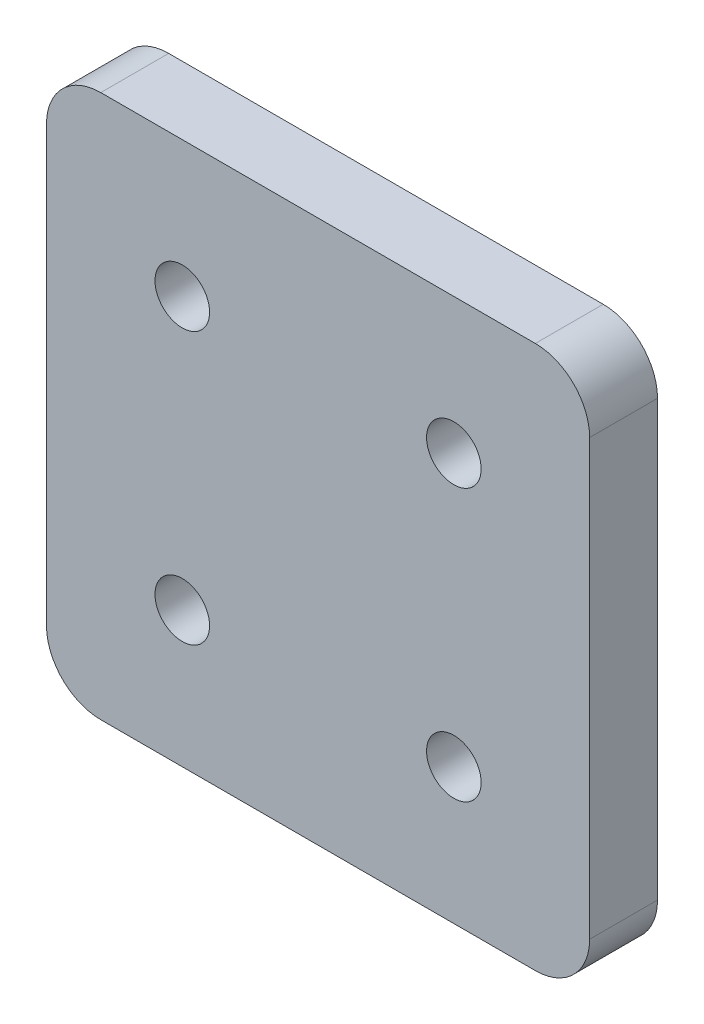
ISO-10303-21;
HEADER;
FILE_DESCRIPTION(('STEP AP214'),'2;1');
FILE_NAME('part.step','',(''),(''),'','','');
FILE_SCHEMA(('AUTOMOTIVE_DESIGN { 1 0 10303 214 1 1 1 1 }'));
ENDSEC;
DATA;
#1=APPLICATION_CONTEXT('core data for automotive mechanical design processes');
#2=APPLICATION_PROTOCOL_DEFINITION('international standard','automotive_design',2000,#1);
#3=PRODUCT_CONTEXT('',#1,'mechanical');
#4=PRODUCT('Part','Part','',(#3));
#5=PRODUCT_RELATED_PRODUCT_CATEGORY('part','',(#4));
#6=PRODUCT_DEFINITION_FORMATION('','',#4);
#7=PRODUCT_DEFINITION_CONTEXT('part definition',#1,'design');
#8=PRODUCT_DEFINITION('design','',#6,#7);
#9=PRODUCT_DEFINITION_SHAPE('','',#8);
#10=(LENGTH_UNIT() NAMED_UNIT(*) SI_UNIT(.MILLI.,.METRE.));
#11=(NAMED_UNIT(*) PLANE_ANGLE_UNIT() SI_UNIT($,.RADIAN.));
#12=(NAMED_UNIT(*) SI_UNIT($,.STERADIAN.) SOLID_ANGLE_UNIT());
#13=UNCERTAINTY_MEASURE_WITH_UNIT(LENGTH_MEASURE(1.E-05),#10,'distance_accuracy_value','');
#14=(GEOMETRIC_REPRESENTATION_CONTEXT(3) GLOBAL_UNCERTAINTY_ASSIGNED_CONTEXT((#13)) GLOBAL_UNIT_ASSIGNED_CONTEXT((#10,
#11,#12)) REPRESENTATION_CONTEXT('',''));
#15=CARTESIAN_POINT('',(0.,0.,0.));
#16=DIRECTION('',(0.,0.,1.));
#17=DIRECTION('',(1.,0.,0.));
#18=AXIS2_PLACEMENT_3D('',#15,#16,#17);
#19=CARTESIAN_POINT('',(62.5025826026413,20.115773711195,6.35));
#20=DIRECTION('',(0.,0.,-1.));
#21=DIRECTION('',(-1.,0.,0.));
#22=AXIS2_PLACEMENT_3D('',#19,#20,#21);
#23=PLANE('',#22);
#24=CARTESIAN_POINT('',(-17.78,-45.72,6.35));
#25=DIRECTION('',(0.,0.,1.));
#26=DIRECTION('',(1.,0.,0.));
#27=AXIS2_PLACEMENT_3D('',#24,#25,#26);
#28=CIRCLE('',#27,5.08);
#29=CARTESIAN_POINT('',(-17.78,-50.8,6.35));
#30=VERTEX_POINT('',#29);
#31=CARTESIAN_POINT('',(-12.7,-45.72,6.35));
#32=VERTEX_POINT('',#31);
#33=EDGE_CURVE('E48',#30,#32,#28,.T.);
#34=ORIENTED_EDGE('',*,*,#33,.T.);
#35=DIRECTION('',(0.,-1.,0.));
#36=VECTOR('',#35,1.);
#37=CARTESIAN_POINT('',(-12.7,0.,6.35));
#38=LINE('',#37,#36);
#39=CARTESIAN_POINT('',(-12.7,-5.07999999999999,6.35));
#40=VERTEX_POINT('',#39);
#41=EDGE_CURVE('E193',#40,#32,#38,.T.);
#42=ORIENTED_EDGE('',*,*,#41,.F.);
#43=CARTESIAN_POINT('',(-17.78,-5.07999999999999,6.35));
#44=DIRECTION('',(0.,0.,1.));
#45=DIRECTION('',(1.,0.,0.));
#46=AXIS2_PLACEMENT_3D('',#43,#44,#45);
#47=CIRCLE('',#46,5.08);
#48=CARTESIAN_POINT('',(-17.78,0.,6.35));
#49=VERTEX_POINT('',#48);
#50=EDGE_CURVE('E196',#49,#40,#47,.F.);
#51=ORIENTED_EDGE('',*,*,#50,.F.);
#52=DIRECTION('',(-1.,0.,0.));
#53=VECTOR('',#52,1.);
#54=CARTESIAN_POINT('',(-58.42,0.,6.35));
#55=LINE('',#54,#53);
#56=CARTESIAN_POINT('',(-58.42,0.,6.35));
#57=VERTEX_POINT('',#56);
#58=EDGE_CURVE('E85',#49,#57,#55,.T.);
#59=ORIENTED_EDGE('',*,*,#58,.T.);
#60=CARTESIAN_POINT('',(-58.42,-5.08,6.35));
#61=DIRECTION('',(0.,0.,1.));
#62=DIRECTION('',(-1.,0.,0.));
#63=AXIS2_PLACEMENT_3D('',#60,#61,#62);
#64=CIRCLE('',#63,5.08);
#65=CARTESIAN_POINT('',(-63.5,-5.08,6.35));
#66=VERTEX_POINT('',#65);
#67=EDGE_CURVE('E163',#57,#66,#64,.T.);
#68=ORIENTED_EDGE('',*,*,#67,.T.);
#69=DIRECTION('',(0.,-1.,0.));
#70=VECTOR('',#69,1.);
#71=CARTESIAN_POINT('',(-63.5,-45.72,6.35));
#72=LINE('',#71,#70);
#73=CARTESIAN_POINT('',(-63.5,-45.72,6.35));
#74=VERTEX_POINT('',#73);
#75=EDGE_CURVE('E153',#66,#74,#72,.T.);
#76=ORIENTED_EDGE('',*,*,#75,.T.);
#77=CARTESIAN_POINT('',(-58.42,-45.72,6.35));
#78=DIRECTION('',(0.,0.,1.));
#79=DIRECTION('',(-1.,0.,0.));
#80=AXIS2_PLACEMENT_3D('',#77,#78,#79);
#81=CIRCLE('',#80,5.08);
#82=CARTESIAN_POINT('',(-58.42,-50.8,6.35));
#83=VERTEX_POINT('',#82);
#84=EDGE_CURVE('E57',#74,#83,#81,.T.);
#85=ORIENTED_EDGE('',*,*,#84,.T.);
#86=DIRECTION('',(1.,0.,0.));
#87=VECTOR('',#86,1.);
#88=CARTESIAN_POINT('',(-3.33319110855351,-50.8,6.35));
#89=LINE('',#88,#87);
#90=EDGE_CURVE('E136',#83,#30,#89,.T.);
#91=ORIENTED_EDGE('',*,*,#90,.T.);
#92=EDGE_LOOP('',(#34,#42,#51,#59,#68,#76,#85,#91));
#93=FACE_BOUND('',#92,.T.);
#94=CARTESIAN_POINT('',(-50.8,-12.7,6.35));
#95=DIRECTION('',(0.,0.,1.));
#96=DIRECTION('',(1.,0.,0.));
#97=AXIS2_PLACEMENT_3D('',#94,#95,#96);
#98=CIRCLE('',#97,2.5527);
#99=CARTESIAN_POINT('',(-48.2473,-12.7,6.35));
#100=VERTEX_POINT('',#99);
#101=EDGE_CURVE('E128',#100,#100,#98,.T.);
#102=ORIENTED_EDGE('',*,*,#101,.F.);
#103=EDGE_LOOP('',(#102));
#104=FACE_BOUND('',#103,.T.);
#105=CARTESIAN_POINT('',(-25.4,-12.7,6.35));
#106=DIRECTION('',(0.,0.,1.));
#107=DIRECTION('',(1.,0.,0.));
#108=AXIS2_PLACEMENT_3D('',#105,#106,#107);
#109=CIRCLE('',#108,2.5527);
#110=CARTESIAN_POINT('',(-22.8473,-12.7,6.35));
#111=VERTEX_POINT('',#110);
#112=EDGE_CURVE('E169',#111,#111,#109,.T.);
#113=ORIENTED_EDGE('',*,*,#112,.F.);
#114=EDGE_LOOP('',(#113));
#115=FACE_BOUND('',#114,.T.);
#116=CARTESIAN_POINT('',(-25.3999999999999,-38.1,6.35));
#117=DIRECTION('',(0.,0.,1.));
#118=DIRECTION('',(1.,0.,0.));
#119=AXIS2_PLACEMENT_3D('',#116,#117,#118);
#120=CIRCLE('',#119,2.5527);
#121=CARTESIAN_POINT('',(-22.8472999999999,-38.1,6.35));
#122=VERTEX_POINT('',#121);
#123=EDGE_CURVE('E174',#122,#122,#120,.T.);
#124=ORIENTED_EDGE('',*,*,#123,.F.);
#125=EDGE_LOOP('',(#124));
#126=FACE_BOUND('',#125,.T.);
#127=CARTESIAN_POINT('',(-50.7999999999999,-38.1,6.35));
#128=DIRECTION('',(0.,0.,1.));
#129=DIRECTION('',(1.,0.,0.));
#130=AXIS2_PLACEMENT_3D('',#127,#128,#129);
#131=CIRCLE('',#130,2.5527);
#132=CARTESIAN_POINT('',(-48.2472999999999,-38.1,6.35));
#133=VERTEX_POINT('',#132);
#134=EDGE_CURVE('E180',#133,#133,#131,.T.);
#135=ORIENTED_EDGE('',*,*,#134,.F.);
#136=EDGE_LOOP('',(#135));
#137=FACE_BOUND('',#136,.T.);
#138=ADVANCED_FACE('F33',(#93,#104,#115,#126,#137),#23,.F.);
#139=CARTESIAN_POINT('',(62.5025826026413,20.115773711195,0.));
#140=DIRECTION('',(0.,0.,-1.));
#141=DIRECTION('',(-1.,0.,0.));
#142=AXIS2_PLACEMENT_3D('',#139,#140,#141);
#143=PLANE('',#142);
#144=CARTESIAN_POINT('',(-25.3999999999999,-38.1,0.));
#145=DIRECTION('',(0.,0.,1.));
#146=DIRECTION('',(1.,0.,0.));
#147=AXIS2_PLACEMENT_3D('',#144,#145,#146);
#148=CIRCLE('',#147,2.5527);
#149=CARTESIAN_POINT('',(-22.8472999999999,-38.1,0.));
#150=VERTEX_POINT('',#149);
#151=EDGE_CURVE('E177',#150,#150,#148,.T.);
#152=ORIENTED_EDGE('',*,*,#151,.T.);
#153=EDGE_LOOP('',(#152));
#154=FACE_BOUND('',#153,.T.);
#155=CARTESIAN_POINT('',(-50.8,-12.7,0.));
#156=DIRECTION('',(0.,0.,1.));
#157=DIRECTION('',(1.,0.,0.));
#158=AXIS2_PLACEMENT_3D('',#155,#156,#157);
#159=CIRCLE('',#158,2.5527);
#160=CARTESIAN_POINT('',(-48.2473,-12.7,0.));
#161=VERTEX_POINT('',#160);
#162=EDGE_CURVE('E133',#161,#161,#159,.T.);
#163=ORIENTED_EDGE('',*,*,#162,.T.);
#164=EDGE_LOOP('',(#163));
#165=FACE_BOUND('',#164,.T.);
#166=DIRECTION('',(0.,-1.,0.));
#167=VECTOR('',#166,1.);
#168=CARTESIAN_POINT('',(-12.7,0.,0.));
#169=LINE('',#168,#167);
#170=CARTESIAN_POINT('',(-12.7,-5.07999999999999,0.));
#171=VERTEX_POINT('',#170);
#172=CARTESIAN_POINT('',(-12.7,-45.72,0.));
#173=VERTEX_POINT('',#172);
#174=EDGE_CURVE('E117',#171,#173,#169,.T.);
#175=ORIENTED_EDGE('',*,*,#174,.T.);
#176=CARTESIAN_POINT('',(-17.78,-45.72,0.));
#177=DIRECTION('',(0.,0.,1.));
#178=DIRECTION('',(1.,0.,0.));
#179=AXIS2_PLACEMENT_3D('',#176,#177,#178);
#180=CIRCLE('',#179,5.08);
#181=CARTESIAN_POINT('',(-17.78,-50.8,0.));
#182=VERTEX_POINT('',#181);
#183=EDGE_CURVE('E121',#182,#173,#180,.T.);
#184=ORIENTED_EDGE('',*,*,#183,.F.);
#185=DIRECTION('',(1.,0.,0.));
#186=VECTOR('',#185,1.);
#187=CARTESIAN_POINT('',(-3.33319110855351,-50.8,0.));
#188=LINE('',#187,#186);
#189=CARTESIAN_POINT('',(-58.42,-50.8,0.));
#190=VERTEX_POINT('',#189);
#191=EDGE_CURVE('E141',#190,#182,#188,.T.);
#192=ORIENTED_EDGE('',*,*,#191,.F.);
#193=CARTESIAN_POINT('',(-58.42,-45.72,0.));
#194=DIRECTION('',(0.,0.,1.));
#195=DIRECTION('',(-1.,0.,0.));
#196=AXIS2_PLACEMENT_3D('',#193,#194,#195);
#197=CIRCLE('',#196,5.08);
#198=CARTESIAN_POINT('',(-63.5,-45.72,0.));
#199=VERTEX_POINT('',#198);
#200=EDGE_CURVE('E78',#199,#190,#197,.T.);
#201=ORIENTED_EDGE('',*,*,#200,.F.);
#202=DIRECTION('',(0.,-1.,0.));
#203=VECTOR('',#202,1.);
#204=CARTESIAN_POINT('',(-63.5,-45.72,0.));
#205=LINE('',#204,#203);
#206=CARTESIAN_POINT('',(-63.5,-5.08,0.));
#207=VERTEX_POINT('',#206);
#208=EDGE_CURVE('E130',#207,#199,#205,.T.);
#209=ORIENTED_EDGE('',*,*,#208,.F.);
#210=CARTESIAN_POINT('',(-58.42,-5.08,0.));
#211=DIRECTION('',(0.,0.,1.));
#212=DIRECTION('',(-1.,0.,0.));
#213=AXIS2_PLACEMENT_3D('',#210,#211,#212);
#214=CIRCLE('',#213,5.08);
#215=CARTESIAN_POINT('',(-58.42,0.,0.));
#216=VERTEX_POINT('',#215);
#217=EDGE_CURVE('E127',#216,#207,#214,.T.);
#218=ORIENTED_EDGE('',*,*,#217,.F.);
#219=DIRECTION('',(-1.,0.,0.));
#220=VECTOR('',#219,1.);
#221=CARTESIAN_POINT('',(-58.42,0.,0.));
#222=LINE('',#221,#220);
#223=CARTESIAN_POINT('',(-17.78,0.,0.));
#224=VERTEX_POINT('',#223);
#225=EDGE_CURVE('E120',#224,#216,#222,.T.);
#226=ORIENTED_EDGE('',*,*,#225,.F.);
#227=CARTESIAN_POINT('',(-17.78,-5.07999999999999,0.));
#228=DIRECTION('',(0.,0.,1.));
#229=DIRECTION('',(1.,0.,0.));
#230=AXIS2_PLACEMENT_3D('',#227,#228,#229);
#231=CIRCLE('',#230,5.08);
#232=EDGE_CURVE('E107',#224,#171,#231,.F.);
#233=ORIENTED_EDGE('',*,*,#232,.T.);
#234=EDGE_LOOP('',(#175,#184,#192,#201,#209,#218,#226,#233));
#235=FACE_BOUND('',#234,.T.);
#236=CARTESIAN_POINT('',(-25.4,-12.7,0.));
#237=DIRECTION('',(0.,0.,1.));
#238=DIRECTION('',(1.,0.,0.));
#239=AXIS2_PLACEMENT_3D('',#236,#237,#238);
#240=CIRCLE('',#239,2.5527);
#241=CARTESIAN_POINT('',(-22.8473,-12.7,0.));
#242=VERTEX_POINT('',#241);
#243=EDGE_CURVE('E171',#242,#242,#240,.T.);
#244=ORIENTED_EDGE('',*,*,#243,.T.);
#245=EDGE_LOOP('',(#244));
#246=FACE_BOUND('',#245,.T.);
#247=CARTESIAN_POINT('',(-50.7999999999999,-38.1,0.));
#248=DIRECTION('',(0.,0.,1.));
#249=DIRECTION('',(1.,0.,0.));
#250=AXIS2_PLACEMENT_3D('',#247,#248,#249);
#251=CIRCLE('',#250,2.5527);
#252=CARTESIAN_POINT('',(-48.2472999999999,-38.1,0.));
#253=VERTEX_POINT('',#252);
#254=EDGE_CURVE('E183',#253,#253,#251,.T.);
#255=ORIENTED_EDGE('',*,*,#254,.T.);
#256=EDGE_LOOP('',(#255));
#257=FACE_BOUND('',#256,.T.);
#258=ADVANCED_FACE('F124',(#154,#165,#235,#246,#257),#143,.T.);
#259=CARTESIAN_POINT('',(-58.42,0.,6.35));
#260=DIRECTION('',(0.,-1.,0.));
#261=DIRECTION('',(0.,0.,-1.));
#262=AXIS2_PLACEMENT_3D('',#259,#260,#261);
#263=PLANE('',#262);
#264=ORIENTED_EDGE('',*,*,#58,.F.);
#265=DIRECTION('',(0.,0.,1.));
#266=VECTOR('',#265,1.);
#267=CARTESIAN_POINT('',(-17.78,0.,0.));
#268=LINE('',#267,#266);
#269=EDGE_CURVE('E111',#224,#49,#268,.T.);
#270=ORIENTED_EDGE('',*,*,#269,.F.);
#271=ORIENTED_EDGE('',*,*,#225,.T.);
#272=DIRECTION('',(0.,0.,-1.));
#273=VECTOR('',#272,1.);
#274=CARTESIAN_POINT('',(-58.42,0.,6.35));
#275=LINE('',#274,#273);
#276=EDGE_CURVE('E11',#57,#216,#275,.T.);
#277=ORIENTED_EDGE('',*,*,#276,.F.);
#278=EDGE_LOOP('',(#264,#270,#271,#277));
#279=FACE_BOUND('',#278,.T.);
#280=ADVANCED_FACE('F35',(#279),#263,.F.);
#281=CARTESIAN_POINT('',(-58.42,-5.08,6.35));
#282=DIRECTION('',(0.,0.,-1.));
#283=DIRECTION('',(-1.,0.,0.));
#284=AXIS2_PLACEMENT_3D('',#281,#282,#283);
#285=CYLINDRICAL_SURFACE('',#284,5.08);
#286=ORIENTED_EDGE('',*,*,#217,.T.);
#287=DIRECTION('',(0.,0.,-1.));
#288=VECTOR('',#287,1.);
#289=CARTESIAN_POINT('',(-63.5,-5.08,6.35));
#290=LINE('',#289,#288);
#291=EDGE_CURVE('E41',#66,#207,#290,.T.);
#292=ORIENTED_EDGE('',*,*,#291,.F.);
#293=ORIENTED_EDGE('',*,*,#67,.F.);
#294=ORIENTED_EDGE('',*,*,#276,.T.);
#295=EDGE_LOOP('',(#286,#292,#293,#294));
#296=FACE_BOUND('',#295,.T.);
#297=ADVANCED_FACE('F232',(#296),#285,.T.);
#298=CARTESIAN_POINT('',(-63.5,-45.72,6.35));
#299=DIRECTION('',(1.,0.,0.));
#300=DIRECTION('',(0.,0.,-1.));
#301=AXIS2_PLACEMENT_3D('',#298,#299,#300);
#302=PLANE('',#301);
#303=ORIENTED_EDGE('',*,*,#208,.T.);
#304=DIRECTION('',(0.,0.,-1.));
#305=VECTOR('',#304,1.);
#306=CARTESIAN_POINT('',(-63.5,-45.72,6.35));
#307=LINE('',#306,#305);
#308=EDGE_CURVE('E146',#74,#199,#307,.T.);
#309=ORIENTED_EDGE('',*,*,#308,.F.);
#310=ORIENTED_EDGE('',*,*,#75,.F.);
#311=ORIENTED_EDGE('',*,*,#291,.T.);
#312=EDGE_LOOP('',(#303,#309,#310,#311));
#313=FACE_BOUND('',#312,.T.);
#314=ADVANCED_FACE('F151',(#313),#302,.F.);
#315=CARTESIAN_POINT('',(-58.42,-45.72,6.35));
#316=DIRECTION('',(0.,0.,-1.));
#317=DIRECTION('',(-1.,0.,0.));
#318=AXIS2_PLACEMENT_3D('',#315,#316,#317);
#319=CYLINDRICAL_SURFACE('',#318,5.08);
#320=ORIENTED_EDGE('',*,*,#200,.T.);
#321=DIRECTION('',(0.,0.,-1.));
#322=VECTOR('',#321,1.);
#323=CARTESIAN_POINT('',(-58.42,-50.8,6.35));
#324=LINE('',#323,#322);
#325=EDGE_CURVE('E144',#83,#190,#324,.T.);
#326=ORIENTED_EDGE('',*,*,#325,.F.);
#327=ORIENTED_EDGE('',*,*,#84,.F.);
#328=ORIENTED_EDGE('',*,*,#308,.T.);
#329=EDGE_LOOP('',(#320,#326,#327,#328));
#330=FACE_BOUND('',#329,.T.);
#331=ADVANCED_FACE('F162',(#330),#319,.T.);
#332=CARTESIAN_POINT('',(-3.33319110855351,-50.8,6.35));
#333=DIRECTION('',(0.,1.,0.));
#334=DIRECTION('',(-1.,0.,0.));
#335=AXIS2_PLACEMENT_3D('',#332,#333,#334);
#336=PLANE('',#335);
#337=ORIENTED_EDGE('',*,*,#191,.T.);
#338=DIRECTION('',(0.,0.,1.));
#339=VECTOR('',#338,1.);
#340=CARTESIAN_POINT('',(-17.78,-50.8,0.));
#341=LINE('',#340,#339);
#342=EDGE_CURVE('E161',#182,#30,#341,.T.);
#343=ORIENTED_EDGE('',*,*,#342,.T.);
#344=ORIENTED_EDGE('',*,*,#90,.F.);
#345=ORIENTED_EDGE('',*,*,#325,.T.);
#346=EDGE_LOOP('',(#337,#343,#344,#345));
#347=FACE_BOUND('',#346,.T.);
#348=ADVANCED_FACE('F159',(#347),#336,.F.);
#349=CARTESIAN_POINT('',(-50.8,-12.7,6.35));
#350=DIRECTION('',(0.,0.,-1.));
#351=DIRECTION('',(-1.,0.,0.));
#352=AXIS2_PLACEMENT_3D('',#349,#350,#351);
#353=CYLINDRICAL_SURFACE('',#352,2.5527);
#354=ORIENTED_EDGE('',*,*,#101,.T.);
#355=EDGE_LOOP('',(#354));
#356=FACE_BOUND('',#355,.T.);
#357=ORIENTED_EDGE('',*,*,#162,.F.);
#358=EDGE_LOOP('',(#357));
#359=FACE_BOUND('',#358,.T.);
#360=ADVANCED_FACE('F224',(#356,#359),#353,.F.);
#361=CARTESIAN_POINT('',(-25.4,-12.7,6.35));
#362=DIRECTION('',(0.,0.,-1.));
#363=DIRECTION('',(-1.,0.,0.));
#364=AXIS2_PLACEMENT_3D('',#361,#362,#363);
#365=CYLINDRICAL_SURFACE('',#364,2.5527);
#366=ORIENTED_EDGE('',*,*,#112,.T.);
#367=EDGE_LOOP('',(#366));
#368=FACE_BOUND('',#367,.T.);
#369=ORIENTED_EDGE('',*,*,#243,.F.);
#370=EDGE_LOOP('',(#369));
#371=FACE_BOUND('',#370,.T.);
#372=ADVANCED_FACE('F264',(#368,#371),#365,.F.);
#373=CARTESIAN_POINT('',(-25.3999999999999,-38.1,6.35));
#374=DIRECTION('',(0.,0.,-1.));
#375=DIRECTION('',(-1.,0.,0.));
#376=AXIS2_PLACEMENT_3D('',#373,#374,#375);
#377=CYLINDRICAL_SURFACE('',#376,2.5527);
#378=ORIENTED_EDGE('',*,*,#123,.T.);
#379=EDGE_LOOP('',(#378));
#380=FACE_BOUND('',#379,.T.);
#381=ORIENTED_EDGE('',*,*,#151,.F.);
#382=EDGE_LOOP('',(#381));
#383=FACE_BOUND('',#382,.T.);
#384=ADVANCED_FACE('F212',(#380,#383),#377,.F.);
#385=CARTESIAN_POINT('',(-50.7999999999999,-38.1,6.35));
#386=DIRECTION('',(0.,0.,-1.));
#387=DIRECTION('',(-1.,0.,0.));
#388=AXIS2_PLACEMENT_3D('',#385,#386,#387);
#389=CYLINDRICAL_SURFACE('',#388,2.5527);
#390=ORIENTED_EDGE('',*,*,#134,.T.);
#391=EDGE_LOOP('',(#390));
#392=FACE_BOUND('',#391,.T.);
#393=ORIENTED_EDGE('',*,*,#254,.F.);
#394=EDGE_LOOP('',(#393));
#395=FACE_BOUND('',#394,.T.);
#396=ADVANCED_FACE('F205',(#392,#395),#389,.F.);
#397=CARTESIAN_POINT('',(-17.78,-45.72,0.));
#398=DIRECTION('',(0.,0.,1.));
#399=DIRECTION('',(1.,0.,0.));
#400=AXIS2_PLACEMENT_3D('',#397,#398,#399);
#401=CYLINDRICAL_SURFACE('',#400,5.08);
#402=ORIENTED_EDGE('',*,*,#33,.F.);
#403=ORIENTED_EDGE('',*,*,#342,.F.);
#404=ORIENTED_EDGE('',*,*,#183,.T.);
#405=DIRECTION('',(0.,0.,1.));
#406=VECTOR('',#405,1.);
#407=CARTESIAN_POINT('',(-12.7,-45.72,0.));
#408=LINE('',#407,#406);
#409=EDGE_CURVE('E189',#173,#32,#408,.T.);
#410=ORIENTED_EDGE('',*,*,#409,.T.);
#411=EDGE_LOOP('',(#402,#403,#404,#410));
#412=FACE_BOUND('',#411,.T.);
#413=ADVANCED_FACE('F203',(#412),#401,.T.);
#414=CARTESIAN_POINT('',(-12.7,0.,0.));
#415=DIRECTION('',(-1.,0.,0.));
#416=DIRECTION('',(0.,-1.,0.));
#417=AXIS2_PLACEMENT_3D('',#414,#415,#416);
#418=PLANE('',#417);
#419=ORIENTED_EDGE('',*,*,#41,.T.);
#420=ORIENTED_EDGE('',*,*,#409,.F.);
#421=ORIENTED_EDGE('',*,*,#174,.F.);
#422=DIRECTION('',(0.,0.,1.));
#423=VECTOR('',#422,1.);
#424=CARTESIAN_POINT('',(-12.7,-5.07999999999999,0.));
#425=LINE('',#424,#423);
#426=EDGE_CURVE('E112',#171,#40,#425,.T.);
#427=ORIENTED_EDGE('',*,*,#426,.T.);
#428=EDGE_LOOP('',(#419,#420,#421,#427));
#429=FACE_BOUND('',#428,.T.);
#430=ADVANCED_FACE('F201',(#429),#418,.F.);
#431=CARTESIAN_POINT('',(-17.78,-5.07999999999999,0.));
#432=DIRECTION('',(0.,0.,1.));
#433=DIRECTION('',(1.,0.,0.));
#434=AXIS2_PLACEMENT_3D('',#431,#432,#433);
#435=CYLINDRICAL_SURFACE('',#434,5.08);
#436=ORIENTED_EDGE('',*,*,#50,.T.);
#437=ORIENTED_EDGE('',*,*,#426,.F.);
#438=ORIENTED_EDGE('',*,*,#232,.F.);
#439=ORIENTED_EDGE('',*,*,#269,.T.);
#440=EDGE_LOOP('',(#436,#437,#438,#439));
#441=FACE_BOUND('',#440,.T.);
#442=ADVANCED_FACE('F110',(#441),#435,.T.);
#443=CLOSED_SHELL('',(#138,#258,#280,#297,#314,#331,#348,#360,#372,#384,#396,#413,#430,#442));
#444=MANIFOLD_SOLID_BREP('B2',#443);
#445=ADVANCED_BREP_SHAPE_REPRESENTATION('',(#18,#444),#14);
#446=SHAPE_DEFINITION_REPRESENTATION(#9,#445);
ENDSEC;
END-ISO-10303-21;
